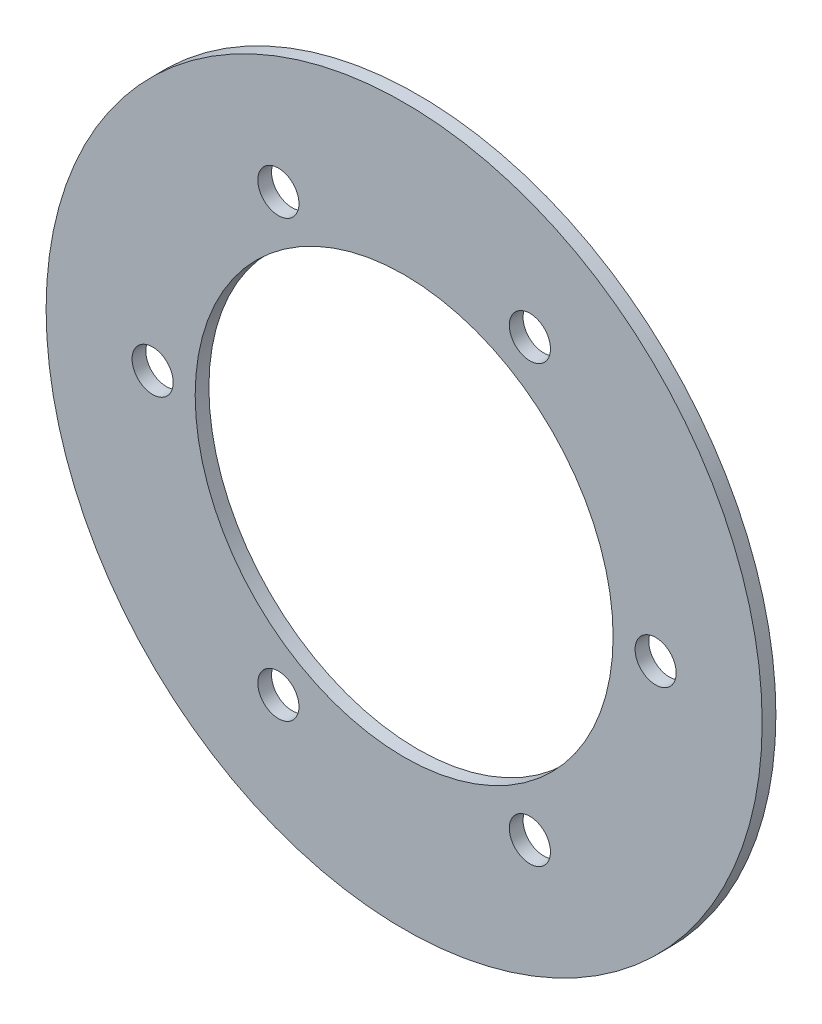
ISO-10303-21;
HEADER;
FILE_DESCRIPTION(('STEP AP214'),'2;1');
FILE_NAME('part.step','',(''),(''),'','','');
FILE_SCHEMA(('AUTOMOTIVE_DESIGN { 1 0 10303 214 1 1 1 1 }'));
ENDSEC;
DATA;
#1=APPLICATION_CONTEXT('core data for automotive mechanical design processes');
#2=APPLICATION_PROTOCOL_DEFINITION('international standard','automotive_design',2000,#1);
#3=PRODUCT_CONTEXT('',#1,'mechanical');
#4=PRODUCT('Part','Part','',(#3));
#5=PRODUCT_RELATED_PRODUCT_CATEGORY('part','',(#4));
#6=PRODUCT_DEFINITION_FORMATION('','',#4);
#7=PRODUCT_DEFINITION_CONTEXT('part definition',#1,'design');
#8=PRODUCT_DEFINITION('design','',#6,#7);
#9=PRODUCT_DEFINITION_SHAPE('','',#8);
#10=(LENGTH_UNIT() NAMED_UNIT(*) SI_UNIT(.MILLI.,.METRE.));
#11=(NAMED_UNIT(*) PLANE_ANGLE_UNIT() SI_UNIT($,.RADIAN.));
#12=(NAMED_UNIT(*) SI_UNIT($,.STERADIAN.) SOLID_ANGLE_UNIT());
#13=UNCERTAINTY_MEASURE_WITH_UNIT(LENGTH_MEASURE(1.E-05),#10,'distance_accuracy_value','');
#14=(GEOMETRIC_REPRESENTATION_CONTEXT(3) GLOBAL_UNCERTAINTY_ASSIGNED_CONTEXT((#13)) GLOBAL_UNIT_ASSIGNED_CONTEXT((#10,
#11,#12)) REPRESENTATION_CONTEXT('',''));
#15=CARTESIAN_POINT('',(0.,0.,0.));
#16=DIRECTION('',(0.,0.,1.));
#17=DIRECTION('',(1.,0.,0.));
#18=AXIS2_PLACEMENT_3D('',#15,#16,#17);
#19=CARTESIAN_POINT('',(0.,0.,1.5));
#20=DIRECTION('',(0.,0.,1.));
#21=DIRECTION('',(1.,0.,0.));
#22=AXIS2_PLACEMENT_3D('',#19,#20,#21);
#23=PLANE('',#22);
#24=CARTESIAN_POINT('',(27.5,0.,1.5));
#25=DIRECTION('',(0.,0.,1.));
#26=DIRECTION('',(1.,0.,0.));
#27=AXIS2_PLACEMENT_3D('',#24,#25,#26);
#28=CIRCLE('',#27,2.25);
#29=CARTESIAN_POINT('',(29.75,0.,1.5));
#30=VERTEX_POINT('',#29);
#31=EDGE_CURVE('E109',#30,#30,#28,.T.);
#32=ORIENTED_EDGE('',*,*,#31,.F.);
#33=EDGE_LOOP('',(#32));
#34=FACE_BOUND('',#33,.T.);
#35=CARTESIAN_POINT('',(13.7499999999999,-23.8156986040721,1.5));
#36=DIRECTION('',(0.,0.,1.));
#37=DIRECTION('',(1.,0.,0.));
#38=AXIS2_PLACEMENT_3D('',#35,#36,#37);
#39=CIRCLE('',#38,2.25);
#40=CARTESIAN_POINT('',(15.9999999999999,-23.8156986040721,1.5));
#41=VERTEX_POINT('',#40);
#42=EDGE_CURVE('E101',#41,#41,#39,.T.);
#43=ORIENTED_EDGE('',*,*,#42,.F.);
#44=EDGE_LOOP('',(#43));
#45=FACE_BOUND('',#44,.T.);
#46=CARTESIAN_POINT('',(-13.7500000000001,-23.815698604072,1.5));
#47=DIRECTION('',(0.,0.,1.));
#48=DIRECTION('',(1.,0.,0.));
#49=AXIS2_PLACEMENT_3D('',#46,#47,#48);
#50=CIRCLE('',#49,2.25);
#51=CARTESIAN_POINT('',(-11.5000000000001,-23.815698604072,1.5));
#52=VERTEX_POINT('',#51);
#53=EDGE_CURVE('E93',#52,#52,#50,.T.);
#54=ORIENTED_EDGE('',*,*,#53,.F.);
#55=EDGE_LOOP('',(#54));
#56=FACE_BOUND('',#55,.T.);
#57=CARTESIAN_POINT('',(-27.5,1.92031473636372E-13,1.5));
#58=DIRECTION('',(0.,0.,1.));
#59=DIRECTION('',(1.,0.,0.));
#60=AXIS2_PLACEMENT_3D('',#57,#58,#59);
#61=CIRCLE('',#60,2.25);
#62=CARTESIAN_POINT('',(-25.25,1.92031473636372E-13,1.5));
#63=VERTEX_POINT('',#62);
#64=EDGE_CURVE('E85',#63,#63,#61,.T.);
#65=ORIENTED_EDGE('',*,*,#64,.F.);
#66=EDGE_LOOP('',(#65));
#67=FACE_BOUND('',#66,.T.);
#68=CARTESIAN_POINT('',(-13.7499999999998,23.8156986040722,1.5));
#69=DIRECTION('',(0.,0.,1.));
#70=DIRECTION('',(1.,0.,0.));
#71=AXIS2_PLACEMENT_3D('',#68,#69,#70);
#72=CIRCLE('',#71,2.25);
#73=CARTESIAN_POINT('',(-11.4999999999998,23.8156986040722,1.5));
#74=VERTEX_POINT('',#73);
#75=EDGE_CURVE('E77',#74,#74,#72,.T.);
#76=ORIENTED_EDGE('',*,*,#75,.F.);
#77=EDGE_LOOP('',(#76));
#78=FACE_BOUND('',#77,.T.);
#79=CARTESIAN_POINT('',(13.7500000000003,23.8156986040719,1.5));
#80=DIRECTION('',(0.,0.,1.));
#81=DIRECTION('',(1.,0.,0.));
#82=AXIS2_PLACEMENT_3D('',#79,#80,#81);
#83=CIRCLE('',#82,2.25);
#84=CARTESIAN_POINT('',(16.0000000000003,23.8156986040719,1.5));
#85=VERTEX_POINT('',#84);
#86=EDGE_CURVE('E69',#85,#85,#83,.T.);
#87=ORIENTED_EDGE('',*,*,#86,.F.);
#88=EDGE_LOOP('',(#87));
#89=FACE_BOUND('',#88,.T.);
#90=CARTESIAN_POINT('',(0.,0.,1.5));
#91=DIRECTION('',(0.,0.,1.));
#92=DIRECTION('',(1.,0.,0.));
#93=AXIS2_PLACEMENT_3D('',#90,#91,#92);
#94=CIRCLE('',#93,39.15);
#95=CARTESIAN_POINT('',(39.15,0.,1.5));
#96=VERTEX_POINT('',#95);
#97=EDGE_CURVE('E10',#96,#96,#94,.T.);
#98=ORIENTED_EDGE('',*,*,#97,.T.);
#99=EDGE_LOOP('',(#98));
#100=FACE_BOUND('',#99,.T.);
#101=CARTESIAN_POINT('',(0.,0.,1.5));
#102=DIRECTION('',(0.,0.,1.));
#103=DIRECTION('',(1.,0.,0.));
#104=AXIS2_PLACEMENT_3D('',#101,#102,#103);
#105=CIRCLE('',#104,22.85);
#106=CARTESIAN_POINT('',(22.85,0.,1.5));
#107=VERTEX_POINT('',#106);
#108=EDGE_CURVE('E56',#107,#107,#105,.T.);
#109=ORIENTED_EDGE('',*,*,#108,.F.);
#110=EDGE_LOOP('',(#109));
#111=FACE_BOUND('',#110,.T.);
#112=ADVANCED_FACE('F43',(#34,#45,#56,#67,#78,#89,#100,#111),#23,.T.);
#113=CARTESIAN_POINT('',(0.,0.,0.));
#114=DIRECTION('',(0.,0.,1.));
#115=DIRECTION('',(1.,0.,0.));
#116=AXIS2_PLACEMENT_3D('',#113,#114,#115);
#117=PLANE('',#116);
#118=CARTESIAN_POINT('',(27.5,0.,0.));
#119=DIRECTION('',(0.,0.,1.));
#120=DIRECTION('',(1.,0.,0.));
#121=AXIS2_PLACEMENT_3D('',#118,#119,#120);
#122=CIRCLE('',#121,2.25);
#123=CARTESIAN_POINT('',(29.75,0.,0.));
#124=VERTEX_POINT('',#123);
#125=EDGE_CURVE('E105',#124,#124,#122,.T.);
#126=ORIENTED_EDGE('',*,*,#125,.T.);
#127=EDGE_LOOP('',(#126));
#128=FACE_BOUND('',#127,.T.);
#129=CARTESIAN_POINT('',(13.7499999999999,-23.8156986040721,0.));
#130=DIRECTION('',(0.,0.,1.));
#131=DIRECTION('',(1.,0.,0.));
#132=AXIS2_PLACEMENT_3D('',#129,#130,#131);
#133=CIRCLE('',#132,2.25);
#134=CARTESIAN_POINT('',(15.9999999999999,-23.8156986040721,0.));
#135=VERTEX_POINT('',#134);
#136=EDGE_CURVE('E97',#135,#135,#133,.T.);
#137=ORIENTED_EDGE('',*,*,#136,.T.);
#138=EDGE_LOOP('',(#137));
#139=FACE_BOUND('',#138,.T.);
#140=CARTESIAN_POINT('',(-13.7500000000001,-23.815698604072,0.));
#141=DIRECTION('',(0.,0.,1.));
#142=DIRECTION('',(1.,0.,0.));
#143=AXIS2_PLACEMENT_3D('',#140,#141,#142);
#144=CIRCLE('',#143,2.25);
#145=CARTESIAN_POINT('',(-11.5000000000001,-23.815698604072,0.));
#146=VERTEX_POINT('',#145);
#147=EDGE_CURVE('E89',#146,#146,#144,.T.);
#148=ORIENTED_EDGE('',*,*,#147,.T.);
#149=EDGE_LOOP('',(#148));
#150=FACE_BOUND('',#149,.T.);
#151=CARTESIAN_POINT('',(-27.5,1.92031473636372E-13,0.));
#152=DIRECTION('',(0.,0.,1.));
#153=DIRECTION('',(1.,0.,0.));
#154=AXIS2_PLACEMENT_3D('',#151,#152,#153);
#155=CIRCLE('',#154,2.25);
#156=CARTESIAN_POINT('',(-25.25,1.92031473636372E-13,0.));
#157=VERTEX_POINT('',#156);
#158=EDGE_CURVE('E81',#157,#157,#155,.T.);
#159=ORIENTED_EDGE('',*,*,#158,.T.);
#160=EDGE_LOOP('',(#159));
#161=FACE_BOUND('',#160,.T.);
#162=CARTESIAN_POINT('',(-13.7499999999998,23.8156986040722,0.));
#163=DIRECTION('',(0.,0.,1.));
#164=DIRECTION('',(1.,0.,0.));
#165=AXIS2_PLACEMENT_3D('',#162,#163,#164);
#166=CIRCLE('',#165,2.25);
#167=CARTESIAN_POINT('',(-11.4999999999998,23.8156986040722,0.));
#168=VERTEX_POINT('',#167);
#169=EDGE_CURVE('E73',#168,#168,#166,.T.);
#170=ORIENTED_EDGE('',*,*,#169,.T.);
#171=EDGE_LOOP('',(#170));
#172=FACE_BOUND('',#171,.T.);
#173=CARTESIAN_POINT('',(13.7500000000003,23.8156986040719,0.));
#174=DIRECTION('',(0.,0.,1.));
#175=DIRECTION('',(1.,0.,0.));
#176=AXIS2_PLACEMENT_3D('',#173,#174,#175);
#177=CIRCLE('',#176,2.25);
#178=CARTESIAN_POINT('',(16.0000000000003,23.8156986040719,0.));
#179=VERTEX_POINT('',#178);
#180=EDGE_CURVE('E62',#179,#179,#177,.T.);
#181=ORIENTED_EDGE('',*,*,#180,.T.);
#182=EDGE_LOOP('',(#181));
#183=FACE_BOUND('',#182,.T.);
#184=CARTESIAN_POINT('',(0.,0.,0.));
#185=DIRECTION('',(0.,0.,1.));
#186=DIRECTION('',(1.,0.,0.));
#187=AXIS2_PLACEMENT_3D('',#184,#185,#186);
#188=CIRCLE('',#187,39.15);
#189=CARTESIAN_POINT('',(39.15,0.,0.));
#190=VERTEX_POINT('',#189);
#191=EDGE_CURVE('E47',#190,#190,#188,.T.);
#192=ORIENTED_EDGE('',*,*,#191,.F.);
#193=EDGE_LOOP('',(#192));
#194=FACE_BOUND('',#193,.T.);
#195=CARTESIAN_POINT('',(0.,0.,0.));
#196=DIRECTION('',(0.,0.,1.));
#197=DIRECTION('',(1.,0.,0.));
#198=AXIS2_PLACEMENT_3D('',#195,#196,#197);
#199=CIRCLE('',#198,22.85);
#200=CARTESIAN_POINT('',(22.85,0.,0.));
#201=VERTEX_POINT('',#200);
#202=EDGE_CURVE('E58',#201,#201,#199,.T.);
#203=ORIENTED_EDGE('',*,*,#202,.T.);
#204=EDGE_LOOP('',(#203));
#205=FACE_BOUND('',#204,.T.);
#206=ADVANCED_FACE('F118',(#128,#139,#150,#161,#172,#183,#194,#205),#117,.F.);
#207=CARTESIAN_POINT('',(0.,0.,1.5));
#208=DIRECTION('',(0.,0.,-1.));
#209=DIRECTION('',(-1.,0.,0.));
#210=AXIS2_PLACEMENT_3D('',#207,#208,#209);
#211=CYLINDRICAL_SURFACE('',#210,39.15);
#212=ORIENTED_EDGE('',*,*,#97,.F.);
#213=EDGE_LOOP('',(#212));
#214=FACE_BOUND('',#213,.T.);
#215=ORIENTED_EDGE('',*,*,#191,.T.);
#216=EDGE_LOOP('',(#215));
#217=FACE_BOUND('',#216,.T.);
#218=ADVANCED_FACE('F45',(#214,#217),#211,.T.);
#219=CARTESIAN_POINT('',(0.,0.,1.5));
#220=DIRECTION('',(0.,0.,-1.));
#221=DIRECTION('',(-1.,0.,0.));
#222=AXIS2_PLACEMENT_3D('',#219,#220,#221);
#223=CYLINDRICAL_SURFACE('',#222,22.85);
#224=ORIENTED_EDGE('',*,*,#108,.T.);
#225=EDGE_LOOP('',(#224));
#226=FACE_BOUND('',#225,.T.);
#227=ORIENTED_EDGE('',*,*,#202,.F.);
#228=EDGE_LOOP('',(#227));
#229=FACE_BOUND('',#228,.T.);
#230=ADVANCED_FACE('F132',(#226,#229),#223,.F.);
#231=CARTESIAN_POINT('',(13.7500000000003,23.8156986040719,1.5));
#232=DIRECTION('',(0.,0.,1.));
#233=DIRECTION('',(1.,0.,0.));
#234=AXIS2_PLACEMENT_3D('',#231,#232,#233);
#235=CYLINDRICAL_SURFACE('',#234,2.25);
#236=ORIENTED_EDGE('',*,*,#180,.F.);
#237=EDGE_LOOP('',(#236));
#238=FACE_BOUND('',#237,.T.);
#239=ORIENTED_EDGE('',*,*,#86,.T.);
#240=EDGE_LOOP('',(#239));
#241=FACE_BOUND('',#240,.T.);
#242=ADVANCED_FACE('F135',(#238,#241),#235,.F.);
#243=CARTESIAN_POINT('',(-13.7499999999998,23.8156986040722,1.5));
#244=DIRECTION('',(0.,0.,1.));
#245=DIRECTION('',(1.,0.,0.));
#246=AXIS2_PLACEMENT_3D('',#243,#244,#245);
#247=CYLINDRICAL_SURFACE('',#246,2.25);
#248=ORIENTED_EDGE('',*,*,#169,.F.);
#249=EDGE_LOOP('',(#248));
#250=FACE_BOUND('',#249,.T.);
#251=ORIENTED_EDGE('',*,*,#75,.T.);
#252=EDGE_LOOP('',(#251));
#253=FACE_BOUND('',#252,.T.);
#254=ADVANCED_FACE('F149',(#250,#253),#247,.F.);
#255=CARTESIAN_POINT('',(-27.5,1.92031473636372E-13,1.5));
#256=DIRECTION('',(0.,0.,1.));
#257=DIRECTION('',(1.,0.,0.));
#258=AXIS2_PLACEMENT_3D('',#255,#256,#257);
#259=CYLINDRICAL_SURFACE('',#258,2.25);
#260=ORIENTED_EDGE('',*,*,#158,.F.);
#261=EDGE_LOOP('',(#260));
#262=FACE_BOUND('',#261,.T.);
#263=ORIENTED_EDGE('',*,*,#64,.T.);
#264=EDGE_LOOP('',(#263));
#265=FACE_BOUND('',#264,.T.);
#266=ADVANCED_FACE('F153',(#262,#265),#259,.F.);
#267=CARTESIAN_POINT('',(-13.7500000000001,-23.815698604072,1.5));
#268=DIRECTION('',(0.,0.,1.));
#269=DIRECTION('',(1.,0.,0.));
#270=AXIS2_PLACEMENT_3D('',#267,#268,#269);
#271=CYLINDRICAL_SURFACE('',#270,2.25);
#272=ORIENTED_EDGE('',*,*,#147,.F.);
#273=EDGE_LOOP('',(#272));
#274=FACE_BOUND('',#273,.T.);
#275=ORIENTED_EDGE('',*,*,#53,.T.);
#276=EDGE_LOOP('',(#275));
#277=FACE_BOUND('',#276,.T.);
#278=ADVANCED_FACE('F157',(#274,#277),#271,.F.);
#279=CARTESIAN_POINT('',(13.7499999999999,-23.8156986040721,1.5));
#280=DIRECTION('',(0.,0.,1.));
#281=DIRECTION('',(1.,0.,0.));
#282=AXIS2_PLACEMENT_3D('',#279,#280,#281);
#283=CYLINDRICAL_SURFACE('',#282,2.25);
#284=ORIENTED_EDGE('',*,*,#136,.F.);
#285=EDGE_LOOP('',(#284));
#286=FACE_BOUND('',#285,.T.);
#287=ORIENTED_EDGE('',*,*,#42,.T.);
#288=EDGE_LOOP('',(#287));
#289=FACE_BOUND('',#288,.T.);
#290=ADVANCED_FACE('F161',(#286,#289),#283,.F.);
#291=CARTESIAN_POINT('',(27.5,0.,1.5));
#292=DIRECTION('',(0.,0.,1.));
#293=DIRECTION('',(1.,0.,0.));
#294=AXIS2_PLACEMENT_3D('',#291,#292,#293);
#295=CYLINDRICAL_SURFACE('',#294,2.25);
#296=ORIENTED_EDGE('',*,*,#125,.F.);
#297=EDGE_LOOP('',(#296));
#298=FACE_BOUND('',#297,.T.);
#299=ORIENTED_EDGE('',*,*,#31,.T.);
#300=EDGE_LOOP('',(#299));
#301=FACE_BOUND('',#300,.T.);
#302=ADVANCED_FACE('F114',(#298,#301),#295,.F.);
#303=CLOSED_SHELL('',(#112,#206,#218,#230,#242,#254,#266,#278,#290,#302));
#304=MANIFOLD_SOLID_BREP('B2',#303);
#305=ADVANCED_BREP_SHAPE_REPRESENTATION('',(#18,#304),#14);
#306=SHAPE_DEFINITION_REPRESENTATION(#9,#305);
ENDSEC;
END-ISO-10303-21;
